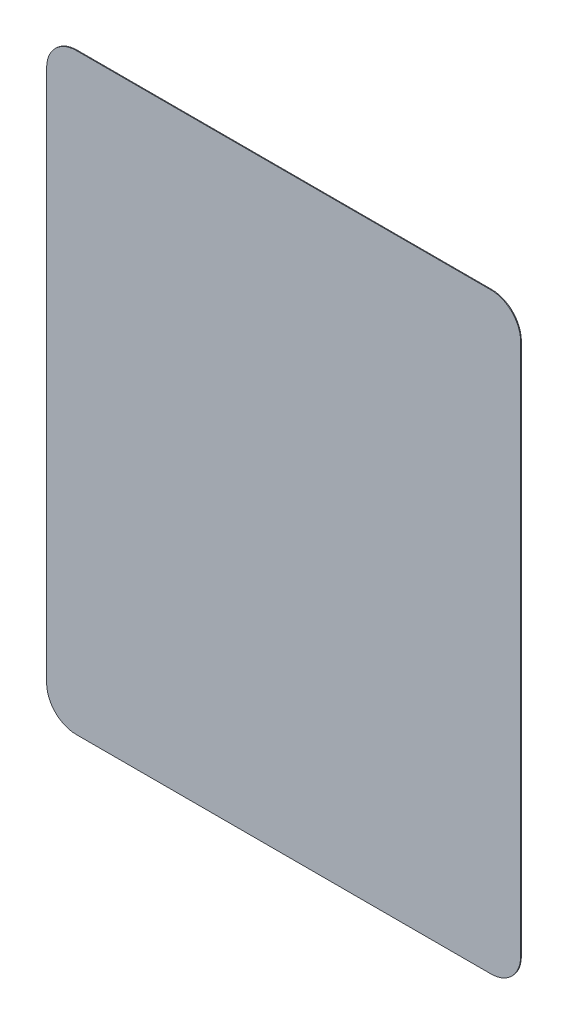
ISO-10303-21;
HEADER;
FILE_DESCRIPTION(('STEP AP214'),'2;1');
FILE_NAME('part.step','',(''),(''),'','','');
FILE_SCHEMA(('AUTOMOTIVE_DESIGN { 1 0 10303 214 1 1 1 1 }'));
ENDSEC;
DATA;
#1=APPLICATION_CONTEXT('core data for automotive mechanical design processes');
#2=APPLICATION_PROTOCOL_DEFINITION('international standard','automotive_design',2000,#1);
#3=PRODUCT_CONTEXT('',#1,'mechanical');
#4=PRODUCT('Part','Part','',(#3));
#5=PRODUCT_RELATED_PRODUCT_CATEGORY('part','',(#4));
#6=PRODUCT_DEFINITION_FORMATION('','',#4);
#7=PRODUCT_DEFINITION_CONTEXT('part definition',#1,'design');
#8=PRODUCT_DEFINITION('design','',#6,#7);
#9=PRODUCT_DEFINITION_SHAPE('','',#8);
#10=(LENGTH_UNIT() NAMED_UNIT(*) SI_UNIT(.MILLI.,.METRE.));
#11=(NAMED_UNIT(*) PLANE_ANGLE_UNIT() SI_UNIT($,.RADIAN.));
#12=(NAMED_UNIT(*) SI_UNIT($,.STERADIAN.) SOLID_ANGLE_UNIT());
#13=UNCERTAINTY_MEASURE_WITH_UNIT(LENGTH_MEASURE(1.E-05),#10,'distance_accuracy_value','');
#14=(GEOMETRIC_REPRESENTATION_CONTEXT(3) GLOBAL_UNCERTAINTY_ASSIGNED_CONTEXT((#13)) GLOBAL_UNIT_ASSIGNED_CONTEXT((#10,
#11,#12)) REPRESENTATION_CONTEXT('',''));
#15=CARTESIAN_POINT('',(0.,0.,0.));
#16=DIRECTION('',(0.,0.,1.));
#17=DIRECTION('',(1.,0.,0.));
#18=AXIS2_PLACEMENT_3D('',#15,#16,#17);
#19=CARTESIAN_POINT('',(17.5,22.5,0.065));
#20=DIRECTION('',(0.,0.,-1.));
#21=DIRECTION('',(-1.,0.,0.));
#22=AXIS2_PLACEMENT_3D('',#19,#20,#21);
#23=CYLINDRICAL_SURFACE('',#22,2.5);
#24=CARTESIAN_POINT('',(17.5,22.5,0.));
#25=DIRECTION('',(0.,0.,1.));
#26=DIRECTION('',(-1.,0.,0.));
#27=AXIS2_PLACEMENT_3D('',#24,#25,#26);
#28=CIRCLE('',#27,2.5);
#29=CARTESIAN_POINT('',(20.,22.5,0.));
#30=VERTEX_POINT('',#29);
#31=CARTESIAN_POINT('',(17.5,25.,0.));
#32=VERTEX_POINT('',#31);
#33=EDGE_CURVE('E128',#30,#32,#28,.T.);
#34=ORIENTED_EDGE('',*,*,#33,.T.);
#35=DIRECTION('',(0.,0.,-1.));
#36=VECTOR('',#35,1.);
#37=CARTESIAN_POINT('',(17.5,25.,0.065));
#38=LINE('',#37,#36);
#39=CARTESIAN_POINT('',(17.5,25.,0.065));
#40=VERTEX_POINT('',#39);
#41=EDGE_CURVE('E11',#40,#32,#38,.T.);
#42=ORIENTED_EDGE('',*,*,#41,.F.);
#43=CARTESIAN_POINT('',(17.5,22.5,0.065));
#44=DIRECTION('',(0.,0.,1.));
#45=DIRECTION('',(-1.,0.,0.));
#46=AXIS2_PLACEMENT_3D('',#43,#44,#45);
#47=CIRCLE('',#46,2.5);
#48=CARTESIAN_POINT('',(20.,22.5,0.065));
#49=VERTEX_POINT('',#48);
#50=EDGE_CURVE('E143',#49,#40,#47,.T.);
#51=ORIENTED_EDGE('',*,*,#50,.F.);
#52=DIRECTION('',(0.,0.,-1.));
#53=VECTOR('',#52,1.);
#54=CARTESIAN_POINT('',(20.,22.5,0.065));
#55=LINE('',#54,#53);
#56=EDGE_CURVE('E124',#49,#30,#55,.T.);
#57=ORIENTED_EDGE('',*,*,#56,.T.);
#58=EDGE_LOOP('',(#34,#42,#51,#57));
#59=FACE_BOUND('',#58,.T.);
#60=ADVANCED_FACE('F33',(#59),#23,.T.);
#61=CARTESIAN_POINT('',(0.,25.,0.065));
#62=DIRECTION('',(0.,-1.,0.));
#63=DIRECTION('',(1.,0.,0.));
#64=AXIS2_PLACEMENT_3D('',#61,#62,#63);
#65=PLANE('',#64);
#66=DIRECTION('',(-1.,0.,0.));
#67=VECTOR('',#66,1.);
#68=CARTESIAN_POINT('',(0.,25.,0.));
#69=LINE('',#68,#67);
#70=CARTESIAN_POINT('',(-17.5,25.,0.));
#71=VERTEX_POINT('',#70);
#72=EDGE_CURVE('E131',#32,#71,#69,.T.);
#73=ORIENTED_EDGE('',*,*,#72,.T.);
#74=DIRECTION('',(0.,0.,-1.));
#75=VECTOR('',#74,1.);
#76=CARTESIAN_POINT('',(-17.5,25.,0.065));
#77=LINE('',#76,#75);
#78=CARTESIAN_POINT('',(-17.5,25.,0.065));
#79=VERTEX_POINT('',#78);
#80=EDGE_CURVE('E41',#79,#71,#77,.T.);
#81=ORIENTED_EDGE('',*,*,#80,.F.);
#82=DIRECTION('',(-1.,0.,0.));
#83=VECTOR('',#82,1.);
#84=CARTESIAN_POINT('',(0.,25.,0.065));
#85=LINE('',#84,#83);
#86=EDGE_CURVE('E92',#40,#79,#85,.T.);
#87=ORIENTED_EDGE('',*,*,#86,.F.);
#88=ORIENTED_EDGE('',*,*,#41,.T.);
#89=EDGE_LOOP('',(#73,#81,#87,#88));
#90=FACE_BOUND('',#89,.T.);
#91=ADVANCED_FACE('F178',(#90),#65,.F.);
#92=CARTESIAN_POINT('',(-17.5,22.5,0.065));
#93=DIRECTION('',(0.,0.,-1.));
#94=DIRECTION('',(-1.,0.,0.));
#95=AXIS2_PLACEMENT_3D('',#92,#93,#94);
#96=CYLINDRICAL_SURFACE('',#95,2.5);
#97=CARTESIAN_POINT('',(-17.5,22.5,0.));
#98=DIRECTION('',(0.,0.,1.));
#99=DIRECTION('',(-1.,0.,0.));
#100=AXIS2_PLACEMENT_3D('',#97,#98,#99);
#101=CIRCLE('',#100,2.5);
#102=CARTESIAN_POINT('',(-20.,22.5,0.));
#103=VERTEX_POINT('',#102);
#104=EDGE_CURVE('E133',#71,#103,#101,.T.);
#105=ORIENTED_EDGE('',*,*,#104,.T.);
#106=DIRECTION('',(0.,0.,-1.));
#107=VECTOR('',#106,1.);
#108=CARTESIAN_POINT('',(-20.,22.5,0.065));
#109=LINE('',#108,#107);
#110=CARTESIAN_POINT('',(-20.,22.5,0.065));
#111=VERTEX_POINT('',#110);
#112=EDGE_CURVE('E150',#111,#103,#109,.T.);
#113=ORIENTED_EDGE('',*,*,#112,.F.);
#114=CARTESIAN_POINT('',(-17.5,22.5,0.065));
#115=DIRECTION('',(0.,0.,1.));
#116=DIRECTION('',(-1.,0.,0.));
#117=AXIS2_PLACEMENT_3D('',#114,#115,#116);
#118=CIRCLE('',#117,2.5);
#119=EDGE_CURVE('E158',#79,#111,#118,.T.);
#120=ORIENTED_EDGE('',*,*,#119,.F.);
#121=ORIENTED_EDGE('',*,*,#80,.T.);
#122=EDGE_LOOP('',(#105,#113,#120,#121));
#123=FACE_BOUND('',#122,.T.);
#124=ADVANCED_FACE('F156',(#123),#96,.T.);
#125=CARTESIAN_POINT('',(-20.,22.5,0.065));
#126=DIRECTION('',(1.,0.,0.));
#127=DIRECTION('',(0.,0.,-1.));
#128=AXIS2_PLACEMENT_3D('',#125,#126,#127);
#129=PLANE('',#128);
#130=DIRECTION('',(0.,-1.,0.));
#131=VECTOR('',#130,1.);
#132=CARTESIAN_POINT('',(-20.,22.5,0.));
#133=LINE('',#132,#131);
#134=CARTESIAN_POINT('',(-20.,-22.5,0.));
#135=VERTEX_POINT('',#134);
#136=EDGE_CURVE('E135',#103,#135,#133,.T.);
#137=ORIENTED_EDGE('',*,*,#136,.T.);
#138=DIRECTION('',(0.,0.,-1.));
#139=VECTOR('',#138,1.);
#140=CARTESIAN_POINT('',(-20.,-22.5,0.065));
#141=LINE('',#140,#139);
#142=CARTESIAN_POINT('',(-20.,-22.5,0.065));
#143=VERTEX_POINT('',#142);
#144=EDGE_CURVE('E147',#143,#135,#141,.T.);
#145=ORIENTED_EDGE('',*,*,#144,.F.);
#146=DIRECTION('',(0.,-1.,0.));
#147=VECTOR('',#146,1.);
#148=CARTESIAN_POINT('',(-20.,22.5,0.065));
#149=LINE('',#148,#147);
#150=EDGE_CURVE('E170',#111,#143,#149,.T.);
#151=ORIENTED_EDGE('',*,*,#150,.F.);
#152=ORIENTED_EDGE('',*,*,#112,.T.);
#153=EDGE_LOOP('',(#137,#145,#151,#152));
#154=FACE_BOUND('',#153,.T.);
#155=ADVANCED_FACE('F166',(#154),#129,.F.);
#156=CARTESIAN_POINT('',(-17.5,-22.5,0.065));
#157=DIRECTION('',(0.,0.,-1.));
#158=DIRECTION('',(-1.,0.,0.));
#159=AXIS2_PLACEMENT_3D('',#156,#157,#158);
#160=CYLINDRICAL_SURFACE('',#159,2.5);
#161=CARTESIAN_POINT('',(-17.5,-22.5,0.));
#162=DIRECTION('',(0.,0.,1.));
#163=DIRECTION('',(-1.,0.,0.));
#164=AXIS2_PLACEMENT_3D('',#161,#162,#163);
#165=CIRCLE('',#164,2.5);
#166=CARTESIAN_POINT('',(-17.5,-25.,0.));
#167=VERTEX_POINT('',#166);
#168=EDGE_CURVE('E137',#135,#167,#165,.T.);
#169=ORIENTED_EDGE('',*,*,#168,.T.);
#170=DIRECTION('',(0.,0.,-1.));
#171=VECTOR('',#170,1.);
#172=CARTESIAN_POINT('',(-17.5,-25.,0.065));
#173=LINE('',#172,#171);
#174=CARTESIAN_POINT('',(-17.5,-25.,0.065));
#175=VERTEX_POINT('',#174);
#176=EDGE_CURVE('E119',#175,#167,#173,.T.);
#177=ORIENTED_EDGE('',*,*,#176,.F.);
#178=CARTESIAN_POINT('',(-17.5,-22.5,0.065));
#179=DIRECTION('',(0.,0.,1.));
#180=DIRECTION('',(-1.,0.,0.));
#181=AXIS2_PLACEMENT_3D('',#178,#179,#180);
#182=CIRCLE('',#181,2.5);
#183=EDGE_CURVE('E111',#143,#175,#182,.T.);
#184=ORIENTED_EDGE('',*,*,#183,.F.);
#185=ORIENTED_EDGE('',*,*,#144,.T.);
#186=EDGE_LOOP('',(#169,#177,#184,#185));
#187=FACE_BOUND('',#186,.T.);
#188=ADVANCED_FACE('F169',(#187),#160,.T.);
#189=CARTESIAN_POINT('',(17.5,-25.,0.065));
#190=DIRECTION('',(0.,1.,0.));
#191=DIRECTION('',(0.,0.,1.));
#192=AXIS2_PLACEMENT_3D('',#189,#190,#191);
#193=PLANE('',#192);
#194=DIRECTION('',(1.,0.,0.));
#195=VECTOR('',#194,1.);
#196=CARTESIAN_POINT('',(17.5,-25.,0.));
#197=LINE('',#196,#195);
#198=CARTESIAN_POINT('',(17.5,-25.,0.));
#199=VERTEX_POINT('',#198);
#200=EDGE_CURVE('E118',#167,#199,#197,.T.);
#201=ORIENTED_EDGE('',*,*,#200,.T.);
#202=DIRECTION('',(0.,0.,-1.));
#203=VECTOR('',#202,1.);
#204=CARTESIAN_POINT('',(17.5,-25.,0.065));
#205=LINE('',#204,#203);
#206=CARTESIAN_POINT('',(17.5,-25.,0.065));
#207=VERTEX_POINT('',#206);
#208=EDGE_CURVE('E116',#207,#199,#205,.T.);
#209=ORIENTED_EDGE('',*,*,#208,.F.);
#210=DIRECTION('',(1.,0.,0.));
#211=VECTOR('',#210,1.);
#212=CARTESIAN_POINT('',(-17.5,-25.,0.065));
#213=LINE('',#212,#211);
#214=EDGE_CURVE('E105',#175,#207,#213,.T.);
#215=ORIENTED_EDGE('',*,*,#214,.F.);
#216=ORIENTED_EDGE('',*,*,#176,.T.);
#217=EDGE_LOOP('',(#201,#209,#215,#216));
#218=FACE_BOUND('',#217,.T.);
#219=ADVANCED_FACE('F117',(#218),#193,.F.);
#220=CARTESIAN_POINT('',(17.5,-22.5,0.065));
#221=DIRECTION('',(0.,0.,-1.));
#222=DIRECTION('',(-1.,0.,0.));
#223=AXIS2_PLACEMENT_3D('',#220,#221,#222);
#224=CYLINDRICAL_SURFACE('',#223,2.5);
#225=CARTESIAN_POINT('',(17.5,-22.5,0.));
#226=DIRECTION('',(0.,0.,1.));
#227=DIRECTION('',(-1.,0.,0.));
#228=AXIS2_PLACEMENT_3D('',#225,#226,#227);
#229=CIRCLE('',#228,2.5);
#230=CARTESIAN_POINT('',(20.,-22.5,0.));
#231=VERTEX_POINT('',#230);
#232=EDGE_CURVE('E78',#199,#231,#229,.T.);
#233=ORIENTED_EDGE('',*,*,#232,.T.);
#234=DIRECTION('',(0.,0.,-1.));
#235=VECTOR('',#234,1.);
#236=CARTESIAN_POINT('',(20.,-22.5,0.065));
#237=LINE('',#236,#235);
#238=CARTESIAN_POINT('',(20.,-22.5,0.065));
#239=VERTEX_POINT('',#238);
#240=EDGE_CURVE('E120',#239,#231,#237,.T.);
#241=ORIENTED_EDGE('',*,*,#240,.F.);
#242=CARTESIAN_POINT('',(17.5,-22.5,0.065));
#243=DIRECTION('',(0.,0.,1.));
#244=DIRECTION('',(-1.,0.,0.));
#245=AXIS2_PLACEMENT_3D('',#242,#243,#244);
#246=CIRCLE('',#245,2.5);
#247=EDGE_CURVE('E109',#207,#239,#246,.T.);
#248=ORIENTED_EDGE('',*,*,#247,.F.);
#249=ORIENTED_EDGE('',*,*,#208,.T.);
#250=EDGE_LOOP('',(#233,#241,#248,#249));
#251=FACE_BOUND('',#250,.T.);
#252=ADVANCED_FACE('F122',(#251),#224,.T.);
#253=CARTESIAN_POINT('',(20.,22.5,0.065));
#254=DIRECTION('',(-1.,0.,0.));
#255=DIRECTION('',(0.,0.,1.));
#256=AXIS2_PLACEMENT_3D('',#253,#254,#255);
#257=PLANE('',#256);
#258=DIRECTION('',(0.,1.,0.));
#259=VECTOR('',#258,1.);
#260=CARTESIAN_POINT('',(20.,22.5,0.));
#261=LINE('',#260,#259);
#262=EDGE_CURVE('E84',#231,#30,#261,.T.);
#263=ORIENTED_EDGE('',*,*,#262,.T.);
#264=ORIENTED_EDGE('',*,*,#56,.F.);
#265=DIRECTION('',(0.,1.,0.));
#266=VECTOR('',#265,1.);
#267=CARTESIAN_POINT('',(20.,22.5,0.065));
#268=LINE('',#267,#266);
#269=EDGE_CURVE('E49',#239,#49,#268,.T.);
#270=ORIENTED_EDGE('',*,*,#269,.F.);
#271=ORIENTED_EDGE('',*,*,#240,.T.);
#272=EDGE_LOOP('',(#263,#264,#270,#271));
#273=FACE_BOUND('',#272,.T.);
#274=ADVANCED_FACE('F194',(#273),#257,.F.);
#275=CARTESIAN_POINT('',(17.5,22.5,0.065));
#276=DIRECTION('',(0.,0.,-1.));
#277=DIRECTION('',(-1.,0.,0.));
#278=AXIS2_PLACEMENT_3D('',#275,#276,#277);
#279=PLANE('',#278);
#280=ORIENTED_EDGE('',*,*,#50,.T.);
#281=ORIENTED_EDGE('',*,*,#86,.T.);
#282=ORIENTED_EDGE('',*,*,#119,.T.);
#283=ORIENTED_EDGE('',*,*,#150,.T.);
#284=ORIENTED_EDGE('',*,*,#183,.T.);
#285=ORIENTED_EDGE('',*,*,#214,.T.);
#286=ORIENTED_EDGE('',*,*,#247,.T.);
#287=ORIENTED_EDGE('',*,*,#269,.T.);
#288=EDGE_LOOP('',(#280,#281,#282,#283,#284,#285,#286,#287));
#289=FACE_BOUND('',#288,.T.);
#290=ADVANCED_FACE('F107',(#289),#279,.F.);
#291=CARTESIAN_POINT('',(17.5,22.5,0.));
#292=DIRECTION('',(0.,0.,-1.));
#293=DIRECTION('',(-1.,0.,0.));
#294=AXIS2_PLACEMENT_3D('',#291,#292,#293);
#295=PLANE('',#294);
#296=ORIENTED_EDGE('',*,*,#33,.F.);
#297=ORIENTED_EDGE('',*,*,#262,.F.);
#298=ORIENTED_EDGE('',*,*,#232,.F.);
#299=ORIENTED_EDGE('',*,*,#200,.F.);
#300=ORIENTED_EDGE('',*,*,#168,.F.);
#301=ORIENTED_EDGE('',*,*,#136,.F.);
#302=ORIENTED_EDGE('',*,*,#104,.F.);
#303=ORIENTED_EDGE('',*,*,#72,.F.);
#304=EDGE_LOOP('',(#296,#297,#298,#299,#300,#301,#302,#303));
#305=FACE_BOUND('',#304,.T.);
#306=ADVANCED_FACE('F162',(#305),#295,.T.);
#307=CLOSED_SHELL('',(#60,#91,#124,#155,#188,#219,#252,#274,#290,#306));
#308=MANIFOLD_SOLID_BREP('B2',#307);
#309=ADVANCED_BREP_SHAPE_REPRESENTATION('',(#18,#308),#14);
#310=SHAPE_DEFINITION_REPRESENTATION(#9,#309);
ENDSEC;
END-ISO-10303-21;
